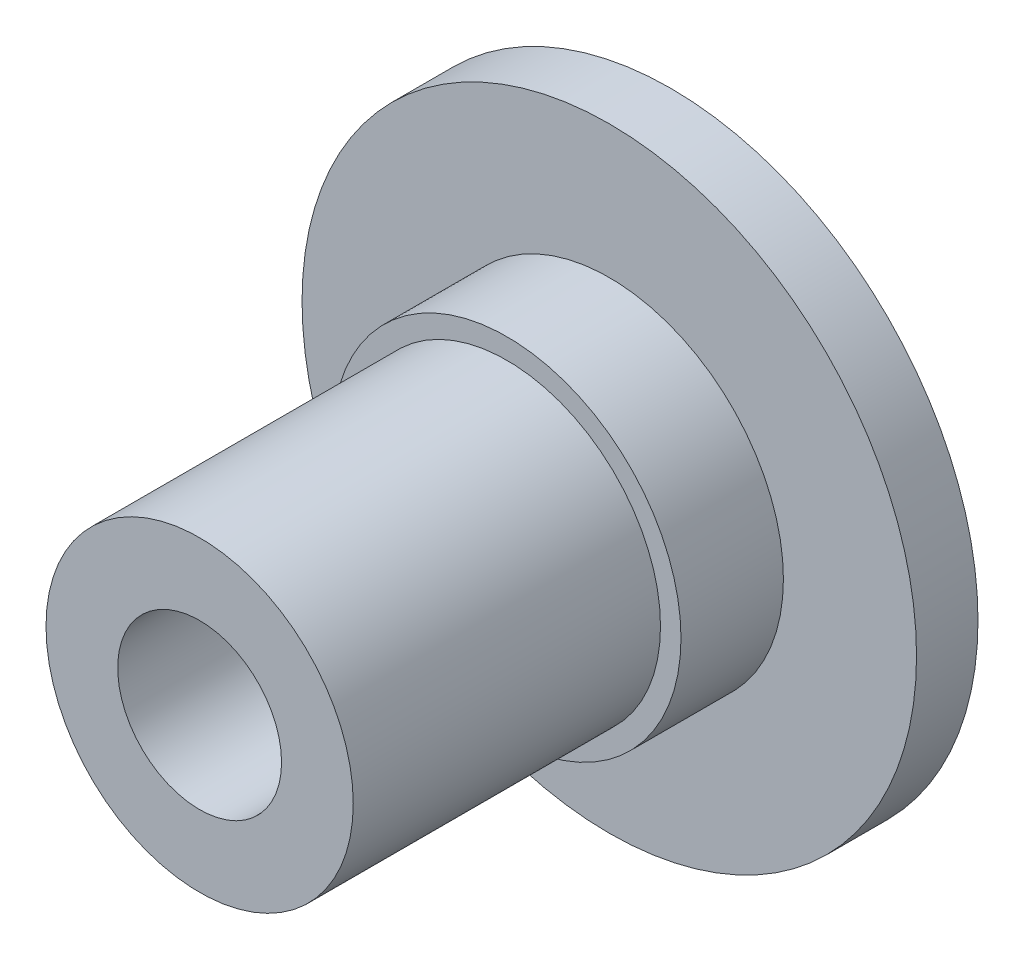
ISO-10303-21;
HEADER;
FILE_DESCRIPTION(('STEP AP214'),'2;1');
FILE_NAME('part.step','',(''),(''),'','','');
FILE_SCHEMA(('AUTOMOTIVE_DESIGN { 1 0 10303 214 1 1 1 1 }'));
ENDSEC;
DATA;
#1=APPLICATION_CONTEXT('core data for automotive mechanical design processes');
#2=APPLICATION_PROTOCOL_DEFINITION('international standard','automotive_design',2000,#1);
#3=PRODUCT_CONTEXT('',#1,'mechanical');
#4=PRODUCT('Part','Part','',(#3));
#5=PRODUCT_RELATED_PRODUCT_CATEGORY('part','',(#4));
#6=PRODUCT_DEFINITION_FORMATION('','',#4);
#7=PRODUCT_DEFINITION_CONTEXT('part definition',#1,'design');
#8=PRODUCT_DEFINITION('design','',#6,#7);
#9=PRODUCT_DEFINITION_SHAPE('','',#8);
#10=(LENGTH_UNIT() NAMED_UNIT(*) SI_UNIT(.MILLI.,.METRE.));
#11=(NAMED_UNIT(*) PLANE_ANGLE_UNIT() SI_UNIT($,.RADIAN.));
#12=(NAMED_UNIT(*) SI_UNIT($,.STERADIAN.) SOLID_ANGLE_UNIT());
#13=UNCERTAINTY_MEASURE_WITH_UNIT(LENGTH_MEASURE(1.E-05),#10,'distance_accuracy_value','');
#14=(GEOMETRIC_REPRESENTATION_CONTEXT(3) GLOBAL_UNCERTAINTY_ASSIGNED_CONTEXT((#13)) GLOBAL_UNIT_ASSIGNED_CONTEXT((#10,
#11,#12)) REPRESENTATION_CONTEXT('',''));
#15=CARTESIAN_POINT('',(0.,0.,0.));
#16=DIRECTION('',(0.,0.,1.));
#17=DIRECTION('',(1.,0.,0.));
#18=AXIS2_PLACEMENT_3D('',#15,#16,#17);
#19=CARTESIAN_POINT('',(0.,0.,23.));
#20=DIRECTION('',(0.,0.,-1.));
#21=DIRECTION('',(-1.,0.,0.));
#22=AXIS2_PLACEMENT_3D('',#19,#20,#21);
#23=CYLINDRICAL_SURFACE('',#22,8.5);
#24=CARTESIAN_POINT('',(0.,0.,3.));
#25=DIRECTION('',(0.,0.,1.));
#26=DIRECTION('',(1.,0.,0.));
#27=AXIS2_PLACEMENT_3D('',#24,#25,#26);
#28=CIRCLE('',#27,8.5);
#29=CARTESIAN_POINT('',(8.5,0.,3.));
#30=VERTEX_POINT('',#29);
#31=EDGE_CURVE('E53',#30,#30,#28,.T.);
#32=ORIENTED_EDGE('',*,*,#31,.T.);
#33=EDGE_LOOP('',(#32));
#34=FACE_BOUND('',#33,.T.);
#35=CARTESIAN_POINT('',(0.,0.,8.));
#36=DIRECTION('',(0.,0.,1.));
#37=DIRECTION('',(1.,0.,0.));
#38=AXIS2_PLACEMENT_3D('',#35,#36,#37);
#39=CIRCLE('',#38,8.5);
#40=CARTESIAN_POINT('',(8.5,0.,8.));
#41=VERTEX_POINT('',#40);
#42=EDGE_CURVE('E50',#41,#41,#39,.T.);
#43=ORIENTED_EDGE('',*,*,#42,.F.);
#44=EDGE_LOOP('',(#43));
#45=FACE_BOUND('',#44,.T.);
#46=ADVANCED_FACE('F32',(#34,#45),#23,.T.);
#47=CARTESIAN_POINT('',(0.,0.,3.));
#48=DIRECTION('',(0.,0.,1.));
#49=DIRECTION('',(1.,0.,0.));
#50=AXIS2_PLACEMENT_3D('',#47,#48,#49);
#51=PLANE('',#50);
#52=CARTESIAN_POINT('',(0.,0.,3.));
#53=DIRECTION('',(0.,0.,1.));
#54=DIRECTION('',(1.,0.,0.));
#55=AXIS2_PLACEMENT_3D('',#52,#53,#54);
#56=CIRCLE('',#55,15.);
#57=CARTESIAN_POINT('',(15.,0.,3.));
#58=VERTEX_POINT('',#57);
#59=EDGE_CURVE('E43',#58,#58,#56,.T.);
#60=ORIENTED_EDGE('',*,*,#59,.T.);
#61=EDGE_LOOP('',(#60));
#62=FACE_BOUND('',#61,.T.);
#63=ORIENTED_EDGE('',*,*,#31,.F.);
#64=EDGE_LOOP('',(#63));
#65=FACE_BOUND('',#64,.T.);
#66=ADVANCED_FACE('F90',(#62,#65),#51,.T.);
#67=CARTESIAN_POINT('',(0.,0.,3.));
#68=DIRECTION('',(0.,0.,-1.));
#69=DIRECTION('',(-1.,0.,0.));
#70=AXIS2_PLACEMENT_3D('',#67,#68,#69);
#71=CYLINDRICAL_SURFACE('',#70,15.);
#72=ORIENTED_EDGE('',*,*,#59,.F.);
#73=EDGE_LOOP('',(#72));
#74=FACE_BOUND('',#73,.T.);
#75=CARTESIAN_POINT('',(0.,0.,0.));
#76=DIRECTION('',(0.,0.,1.));
#77=DIRECTION('',(1.,0.,0.));
#78=AXIS2_PLACEMENT_3D('',#75,#76,#77);
#79=CIRCLE('',#78,15.);
#80=CARTESIAN_POINT('',(15.,0.,0.));
#81=VERTEX_POINT('',#80);
#82=EDGE_CURVE('E47',#81,#81,#79,.T.);
#83=ORIENTED_EDGE('',*,*,#82,.T.);
#84=EDGE_LOOP('',(#83));
#85=FACE_BOUND('',#84,.T.);
#86=ADVANCED_FACE('F96',(#74,#85),#71,.T.);
#87=CARTESIAN_POINT('',(0.,0.,0.));
#88=DIRECTION('',(0.,0.,1.));
#89=DIRECTION('',(1.,0.,0.));
#90=AXIS2_PLACEMENT_3D('',#87,#88,#89);
#91=PLANE('',#90);
#92=CARTESIAN_POINT('',(0.,0.,0.));
#93=DIRECTION('',(0.,0.,1.));
#94=DIRECTION('',(1.,0.,0.));
#95=AXIS2_PLACEMENT_3D('',#92,#93,#94);
#96=CIRCLE('',#95,6.8);
#97=CARTESIAN_POINT('',(6.8,0.,0.));
#98=VERTEX_POINT('',#97);
#99=EDGE_CURVE('E39',#98,#98,#96,.T.);
#100=ORIENTED_EDGE('',*,*,#99,.T.);
#101=EDGE_LOOP('',(#100));
#102=FACE_BOUND('',#101,.T.);
#103=ORIENTED_EDGE('',*,*,#82,.F.);
#104=EDGE_LOOP('',(#103));
#105=FACE_BOUND('',#104,.T.);
#106=ADVANCED_FACE('F85',(#102,#105),#91,.F.);
#107=CARTESIAN_POINT('',(0.,0.,8.));
#108=DIRECTION('',(0.,0.,1.));
#109=DIRECTION('',(1.,0.,0.));
#110=AXIS2_PLACEMENT_3D('',#107,#108,#109);
#111=PLANE('',#110);
#112=CARTESIAN_POINT('',(0.,0.,8.));
#113=DIRECTION('',(0.,0.,1.));
#114=DIRECTION('',(1.,0.,0.));
#115=AXIS2_PLACEMENT_3D('',#112,#113,#114);
#116=CIRCLE('',#115,7.5);
#117=CARTESIAN_POINT('',(7.5,0.,8.));
#118=VERTEX_POINT('',#117);
#119=EDGE_CURVE('E54',#118,#118,#116,.T.);
#120=ORIENTED_EDGE('',*,*,#119,.F.);
#121=EDGE_LOOP('',(#120));
#122=FACE_BOUND('',#121,.T.);
#123=ORIENTED_EDGE('',*,*,#42,.T.);
#124=EDGE_LOOP('',(#123));
#125=FACE_BOUND('',#124,.T.);
#126=ADVANCED_FACE('F78',(#122,#125),#111,.T.);
#127=CARTESIAN_POINT('',(0.,0.,8.));
#128=DIRECTION('',(0.,0.,1.));
#129=DIRECTION('',(1.,0.,0.));
#130=AXIS2_PLACEMENT_3D('',#127,#128,#129);
#131=CYLINDRICAL_SURFACE('',#130,7.5);
#132=ORIENTED_EDGE('',*,*,#119,.T.);
#133=EDGE_LOOP('',(#132));
#134=FACE_BOUND('',#133,.T.);
#135=CARTESIAN_POINT('',(0.,0.,23.));
#136=DIRECTION('',(0.,0.,1.));
#137=DIRECTION('',(1.,0.,0.));
#138=AXIS2_PLACEMENT_3D('',#135,#136,#137);
#139=CIRCLE('',#138,7.5);
#140=CARTESIAN_POINT('',(7.5,0.,23.));
#141=VERTEX_POINT('',#140);
#142=EDGE_CURVE('E59',#141,#141,#139,.T.);
#143=ORIENTED_EDGE('',*,*,#142,.F.);
#144=EDGE_LOOP('',(#143));
#145=FACE_BOUND('',#144,.T.);
#146=ADVANCED_FACE('F73',(#134,#145),#131,.T.);
#147=CARTESIAN_POINT('',(0.,0.,23.));
#148=DIRECTION('',(0.,0.,1.));
#149=DIRECTION('',(1.,0.,0.));
#150=AXIS2_PLACEMENT_3D('',#147,#148,#149);
#151=PLANE('',#150);
#152=CARTESIAN_POINT('',(0.,0.,23.));
#153=DIRECTION('',(0.,0.,1.));
#154=DIRECTION('',(1.,0.,0.));
#155=AXIS2_PLACEMENT_3D('',#152,#153,#154);
#156=CIRCLE('',#155,4.);
#157=CARTESIAN_POINT('',(4.,0.,23.));
#158=VERTEX_POINT('',#157);
#159=EDGE_CURVE('E62',#158,#158,#156,.T.);
#160=ORIENTED_EDGE('',*,*,#159,.F.);
#161=EDGE_LOOP('',(#160));
#162=FACE_BOUND('',#161,.T.);
#163=ORIENTED_EDGE('',*,*,#142,.T.);
#164=EDGE_LOOP('',(#163));
#165=FACE_BOUND('',#164,.T.);
#166=ADVANCED_FACE('F70',(#162,#165),#151,.T.);
#167=CARTESIAN_POINT('',(0.,0.,-14.));
#168=DIRECTION('',(0.,0.,1.));
#169=DIRECTION('',(1.,0.,0.));
#170=AXIS2_PLACEMENT_3D('',#167,#168,#169);
#171=CYLINDRICAL_SURFACE('',#170,4.);
#172=CARTESIAN_POINT('',(0.,0.,2.8));
#173=DIRECTION('',(0.,0.,1.));
#174=DIRECTION('',(1.,0.,0.));
#175=AXIS2_PLACEMENT_3D('',#172,#173,#174);
#176=CIRCLE('',#175,4.);
#177=CARTESIAN_POINT('',(4.,0.,2.8));
#178=VERTEX_POINT('',#177);
#179=EDGE_CURVE('E10',#178,#178,#176,.F.);
#180=ORIENTED_EDGE('',*,*,#179,.T.);
#181=EDGE_LOOP('',(#180));
#182=FACE_BOUND('',#181,.T.);
#183=ORIENTED_EDGE('',*,*,#159,.T.);
#184=EDGE_LOOP('',(#183));
#185=FACE_BOUND('',#184,.T.);
#186=ADVANCED_FACE('F68',(#182,#185),#171,.F.);
#187=CARTESIAN_POINT('',(0.,0.,0.));
#188=DIRECTION('',(0.,0.,-1.));
#189=DIRECTION('',(-1.,0.,0.));
#190=AXIS2_PLACEMENT_3D('',#187,#188,#189);
#191=CONICAL_SURFACE('',#190,6.8,0.785398163397448);
#192=ORIENTED_EDGE('',*,*,#179,.F.);
#193=EDGE_LOOP('',(#192));
#194=FACE_BOUND('',#193,.T.);
#195=ORIENTED_EDGE('',*,*,#99,.F.);
#196=EDGE_LOOP('',(#195));
#197=FACE_BOUND('',#196,.T.);
#198=ADVANCED_FACE('F34',(#194,#197),#191,.F.);
#199=CLOSED_SHELL('',(#46,#66,#86,#106,#126,#146,#166,#186,#198));
#200=MANIFOLD_SOLID_BREP('B2',#199);
#201=ADVANCED_BREP_SHAPE_REPRESENTATION('',(#18,#200),#14);
#202=SHAPE_DEFINITION_REPRESENTATION(#9,#201);
ENDSEC;
END-ISO-10303-21;
